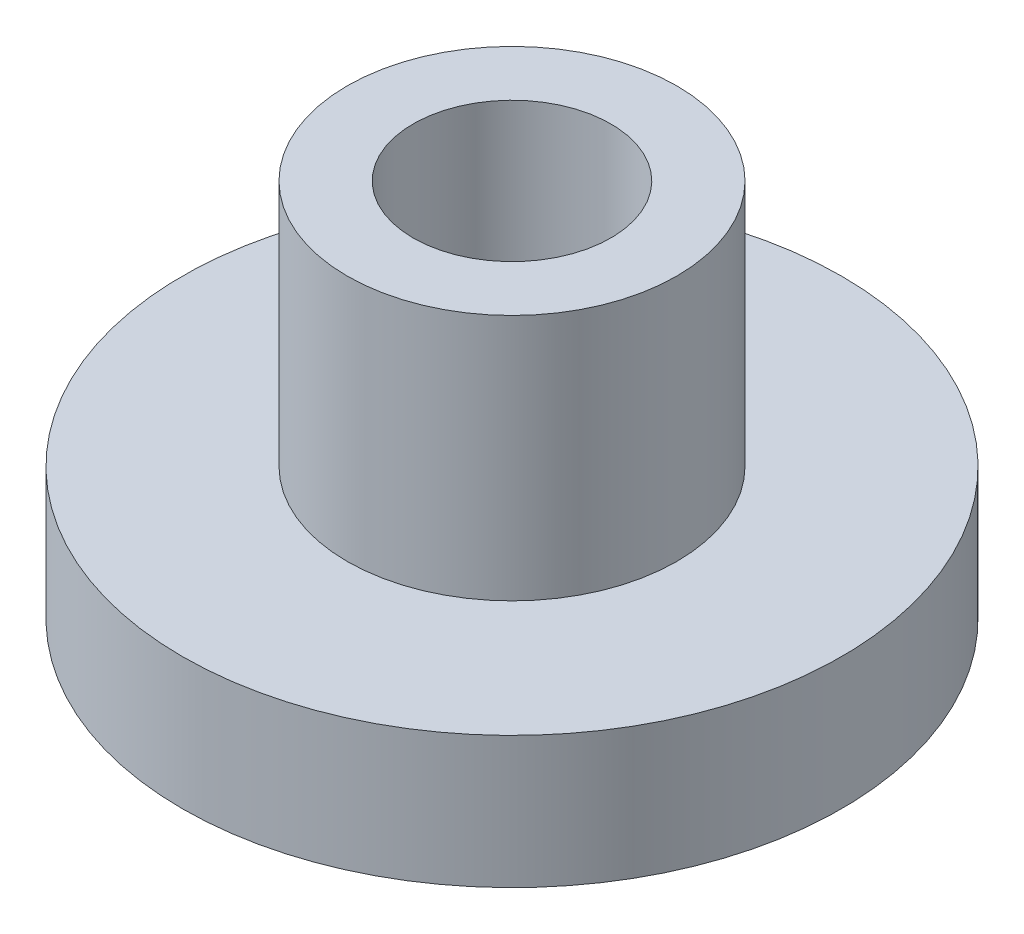
ISO-10303-21;
HEADER;
FILE_DESCRIPTION(('STEP AP214'),'2;1');
FILE_NAME('part.step','',(''),(''),'','','');
FILE_SCHEMA(('AUTOMOTIVE_DESIGN { 1 0 10303 214 1 1 1 1 }'));
ENDSEC;
DATA;
#1=APPLICATION_CONTEXT('core data for automotive mechanical design processes');
#2=APPLICATION_PROTOCOL_DEFINITION('international standard','automotive_design',2000,#1);
#3=PRODUCT_CONTEXT('',#1,'mechanical');
#4=PRODUCT('Part','Part','',(#3));
#5=PRODUCT_RELATED_PRODUCT_CATEGORY('part','',(#4));
#6=PRODUCT_DEFINITION_FORMATION('','',#4);
#7=PRODUCT_DEFINITION_CONTEXT('part definition',#1,'design');
#8=PRODUCT_DEFINITION('design','',#6,#7);
#9=PRODUCT_DEFINITION_SHAPE('','',#8);
#10=(LENGTH_UNIT() NAMED_UNIT(*) SI_UNIT(.MILLI.,.METRE.));
#11=(NAMED_UNIT(*) PLANE_ANGLE_UNIT() SI_UNIT($,.RADIAN.));
#12=(NAMED_UNIT(*) SI_UNIT($,.STERADIAN.) SOLID_ANGLE_UNIT());
#13=UNCERTAINTY_MEASURE_WITH_UNIT(LENGTH_MEASURE(1.E-05),#10,'distance_accuracy_value','');
#14=(GEOMETRIC_REPRESENTATION_CONTEXT(3) GLOBAL_UNCERTAINTY_ASSIGNED_CONTEXT((#13)) GLOBAL_UNIT_ASSIGNED_CONTEXT((#10,
#11,#12)) REPRESENTATION_CONTEXT('',''));
#15=CARTESIAN_POINT('',(0.,0.,0.));
#16=DIRECTION('',(0.,0.,1.));
#17=DIRECTION('',(1.,0.,0.));
#18=AXIS2_PLACEMENT_3D('',#15,#16,#17);
#19=CARTESIAN_POINT('',(0.,2.,0.));
#20=DIRECTION('',(0.,-1.,0.));
#21=DIRECTION('',(0.,0.,-1.));
#22=AXIS2_PLACEMENT_3D('',#19,#20,#21);
#23=CYLINDRICAL_SURFACE('',#22,5.);
#24=CARTESIAN_POINT('',(0.,2.,0.));
#25=DIRECTION('',(0.,1.,0.));
#26=DIRECTION('',(0.,0.,1.));
#27=AXIS2_PLACEMENT_3D('',#24,#25,#26);
#28=CIRCLE('',#27,5.);
#29=CARTESIAN_POINT('',(0.,2.,5.));
#30=VERTEX_POINT('',#29);
#31=EDGE_CURVE('E51',#30,#30,#28,.T.);
#32=ORIENTED_EDGE('',*,*,#31,.F.);
#33=EDGE_LOOP('',(#32));
#34=FACE_BOUND('',#33,.T.);
#35=CARTESIAN_POINT('',(0.,0.,0.));
#36=DIRECTION('',(0.,1.,0.));
#37=DIRECTION('',(0.,0.,1.));
#38=AXIS2_PLACEMENT_3D('',#35,#36,#37);
#39=CIRCLE('',#38,5.);
#40=CARTESIAN_POINT('',(0.,0.,5.));
#41=VERTEX_POINT('',#40);
#42=EDGE_CURVE('E46',#41,#41,#39,.T.);
#43=ORIENTED_EDGE('',*,*,#42,.T.);
#44=EDGE_LOOP('',(#43));
#45=FACE_BOUND('',#44,.T.);
#46=ADVANCED_FACE('F43',(#34,#45),#23,.T.);
#47=CARTESIAN_POINT('',(0.,2.,0.));
#48=DIRECTION('',(0.,1.,0.));
#49=DIRECTION('',(0.,0.,1.));
#50=AXIS2_PLACEMENT_3D('',#47,#48,#49);
#51=PLANE('',#50);
#52=CARTESIAN_POINT('',(0.,2.,0.));
#53=DIRECTION('',(0.,1.,0.));
#54=DIRECTION('',(0.,0.,1.));
#55=AXIS2_PLACEMENT_3D('',#52,#53,#54);
#56=CIRCLE('',#55,2.5);
#57=CARTESIAN_POINT('',(0.,2.,2.5));
#58=VERTEX_POINT('',#57);
#59=EDGE_CURVE('E10',#58,#58,#56,.T.);
#60=ORIENTED_EDGE('',*,*,#59,.F.);
#61=EDGE_LOOP('',(#60));
#62=FACE_BOUND('',#61,.T.);
#63=ORIENTED_EDGE('',*,*,#31,.T.);
#64=EDGE_LOOP('',(#63));
#65=FACE_BOUND('',#64,.T.);
#66=ADVANCED_FACE('F93',(#62,#65),#51,.T.);
#67=CARTESIAN_POINT('',(0.,0.,0.));
#68=DIRECTION('',(0.,1.,0.));
#69=DIRECTION('',(0.,0.,1.));
#70=AXIS2_PLACEMENT_3D('',#67,#68,#69);
#71=PLANE('',#70);
#72=ORIENTED_EDGE('',*,*,#42,.F.);
#73=EDGE_LOOP('',(#72));
#74=FACE_BOUND('',#73,.T.);
#75=ADVANCED_FACE('F87',(#74),#71,.F.);
#76=CARTESIAN_POINT('',(0.,5.75,0.));
#77=DIRECTION('',(0.,-1.,0.));
#78=DIRECTION('',(0.,0.,-1.));
#79=AXIS2_PLACEMENT_3D('',#76,#77,#78);
#80=CYLINDRICAL_SURFACE('',#79,2.5);
#81=CARTESIAN_POINT('',(0.,5.75,0.));
#82=DIRECTION('',(0.,1.,0.));
#83=DIRECTION('',(0.,0.,1.));
#84=AXIS2_PLACEMENT_3D('',#81,#82,#83);
#85=CIRCLE('',#84,2.5);
#86=CARTESIAN_POINT('',(0.,5.75,2.5));
#87=VERTEX_POINT('',#86);
#88=EDGE_CURVE('E58',#87,#87,#85,.T.);
#89=ORIENTED_EDGE('',*,*,#88,.F.);
#90=EDGE_LOOP('',(#89));
#91=FACE_BOUND('',#90,.T.);
#92=ORIENTED_EDGE('',*,*,#59,.T.);
#93=EDGE_LOOP('',(#92));
#94=FACE_BOUND('',#93,.T.);
#95=ADVANCED_FACE('F82',(#91,#94),#80,.T.);
#96=CARTESIAN_POINT('',(0.,5.75,0.));
#97=DIRECTION('',(0.,1.,0.));
#98=DIRECTION('',(0.,0.,1.));
#99=AXIS2_PLACEMENT_3D('',#96,#97,#98);
#100=PLANE('',#99);
#101=CARTESIAN_POINT('',(0.,5.75,0.));
#102=DIRECTION('',(0.,1.,0.));
#103=DIRECTION('',(0.,0.,1.));
#104=AXIS2_PLACEMENT_3D('',#101,#102,#103);
#105=CIRCLE('',#104,1.5);
#106=CARTESIAN_POINT('',(0.,5.75,1.5));
#107=VERTEX_POINT('',#106);
#108=EDGE_CURVE('E63',#107,#107,#105,.T.);
#109=ORIENTED_EDGE('',*,*,#108,.F.);
#110=EDGE_LOOP('',(#109));
#111=FACE_BOUND('',#110,.T.);
#112=ORIENTED_EDGE('',*,*,#88,.T.);
#113=EDGE_LOOP('',(#112));
#114=FACE_BOUND('',#113,.T.);
#115=ADVANCED_FACE('F76',(#111,#114),#100,.T.);
#116=CARTESIAN_POINT('',(0.,1.75,0.));
#117=DIRECTION('',(0.,1.,0.));
#118=DIRECTION('',(0.,0.,1.));
#119=AXIS2_PLACEMENT_3D('',#116,#117,#118);
#120=CYLINDRICAL_SURFACE('',#119,1.5);
#121=CARTESIAN_POINT('',(0.,1.75,0.));
#122=DIRECTION('',(0.,1.,0.));
#123=DIRECTION('',(0.,0.,1.));
#124=AXIS2_PLACEMENT_3D('',#121,#122,#123);
#125=CIRCLE('',#124,1.5);
#126=CARTESIAN_POINT('',(0.,1.75,1.5));
#127=VERTEX_POINT('',#126);
#128=EDGE_CURVE('E62',#127,#127,#125,.T.);
#129=ORIENTED_EDGE('',*,*,#128,.F.);
#130=EDGE_LOOP('',(#129));
#131=FACE_BOUND('',#130,.T.);
#132=ORIENTED_EDGE('',*,*,#108,.T.);
#133=EDGE_LOOP('',(#132));
#134=FACE_BOUND('',#133,.T.);
#135=ADVANCED_FACE('F73',(#131,#134),#120,.F.);
#136=CARTESIAN_POINT('',(0.,1.75,0.));
#137=DIRECTION('',(0.,1.,0.));
#138=DIRECTION('',(0.,0.,1.));
#139=AXIS2_PLACEMENT_3D('',#136,#137,#138);
#140=PLANE('',#139);
#141=ORIENTED_EDGE('',*,*,#128,.T.);
#142=EDGE_LOOP('',(#141));
#143=FACE_BOUND('',#142,.T.);
#144=ADVANCED_FACE('F71',(#143),#140,.T.);
#145=CLOSED_SHELL('',(#46,#66,#75,#95,#115,#135,#144));
#146=MANIFOLD_SOLID_BREP('B2',#145);
#147=ADVANCED_BREP_SHAPE_REPRESENTATION('',(#18,#146),#14);
#148=SHAPE_DEFINITION_REPRESENTATION(#9,#147);
ENDSEC;
END-ISO-10303-21;
